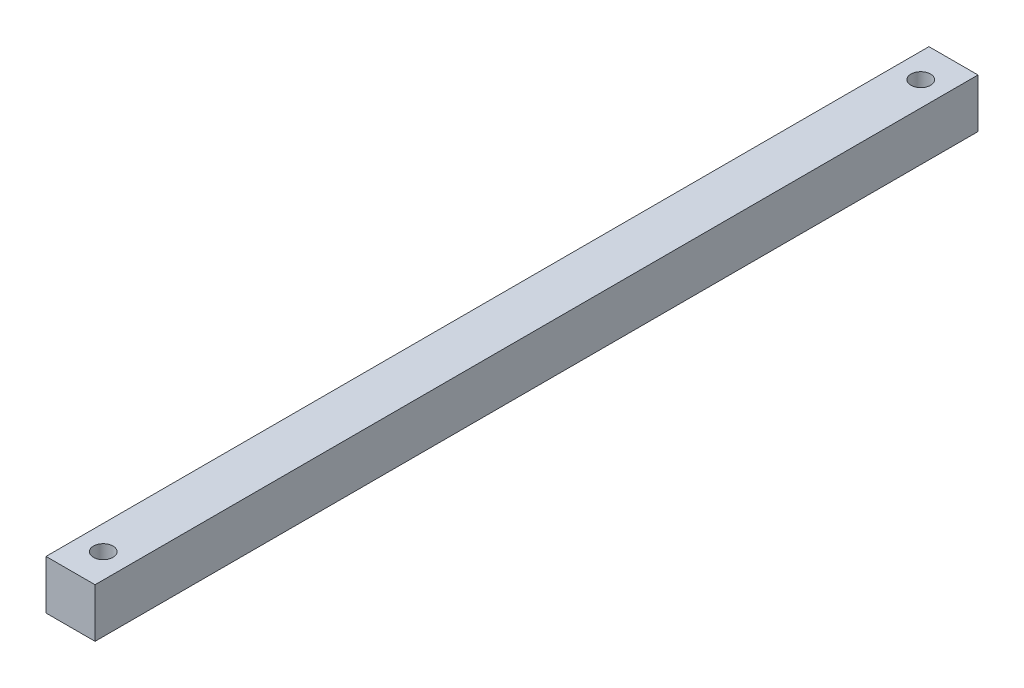
ISO-10303-21;
HEADER;
FILE_DESCRIPTION(('STEP AP214'),'2;1');
FILE_NAME('part.step','',(''),(''),'','','');
FILE_SCHEMA(('AUTOMOTIVE_DESIGN { 1 0 10303 214 1 1 1 1 }'));
ENDSEC;
DATA;
#1=APPLICATION_CONTEXT('core data for automotive mechanical design processes');
#2=APPLICATION_PROTOCOL_DEFINITION('international standard','automotive_design',2000,#1);
#3=PRODUCT_CONTEXT('',#1,'mechanical');
#4=PRODUCT('Part','Part','',(#3));
#5=PRODUCT_RELATED_PRODUCT_CATEGORY('part','',(#4));
#6=PRODUCT_DEFINITION_FORMATION('','',#4);
#7=PRODUCT_DEFINITION_CONTEXT('part definition',#1,'design');
#8=PRODUCT_DEFINITION('design','',#6,#7);
#9=PRODUCT_DEFINITION_SHAPE('','',#8);
#10=(LENGTH_UNIT() NAMED_UNIT(*) SI_UNIT(.MILLI.,.METRE.));
#11=(NAMED_UNIT(*) PLANE_ANGLE_UNIT() SI_UNIT($,.RADIAN.));
#12=(NAMED_UNIT(*) SI_UNIT($,.STERADIAN.) SOLID_ANGLE_UNIT());
#13=UNCERTAINTY_MEASURE_WITH_UNIT(LENGTH_MEASURE(1.E-05),#10,'distance_accuracy_value','');
#14=(GEOMETRIC_REPRESENTATION_CONTEXT(3) GLOBAL_UNCERTAINTY_ASSIGNED_CONTEXT((#13)) GLOBAL_UNIT_ASSIGNED_CONTEXT((#10,
#11,#12)) REPRESENTATION_CONTEXT('',''));
#15=CARTESIAN_POINT('',(0.,0.,0.));
#16=DIRECTION('',(0.,0.,1.));
#17=DIRECTION('',(1.,0.,0.));
#18=AXIS2_PLACEMENT_3D('',#15,#16,#17);
#19=CARTESIAN_POINT('',(0.,0.,270.));
#20=DIRECTION('',(1.,0.,0.));
#21=DIRECTION('',(0.,1.,0.));
#22=AXIS2_PLACEMENT_3D('',#19,#20,#21);
#23=PLANE('',#22);
#24=DIRECTION('',(0.,-1.,0.));
#25=VECTOR('',#24,1.);
#26=CARTESIAN_POINT('',(0.,0.,0.));
#27=LINE('',#26,#25);
#28=CARTESIAN_POINT('',(0.,0.,0.));
#29=VERTEX_POINT('',#28);
#30=CARTESIAN_POINT('',(0.,-15.,0.));
#31=VERTEX_POINT('',#30);
#32=EDGE_CURVE('E104',#29,#31,#27,.T.);
#33=ORIENTED_EDGE('',*,*,#32,.T.);
#34=DIRECTION('',(0.,0.,-1.));
#35=VECTOR('',#34,1.);
#36=CARTESIAN_POINT('',(0.,-15.,270.));
#37=LINE('',#36,#35);
#38=CARTESIAN_POINT('',(0.,-15.,270.));
#39=VERTEX_POINT('',#38);
#40=EDGE_CURVE('E11',#39,#31,#37,.T.);
#41=ORIENTED_EDGE('',*,*,#40,.F.);
#42=DIRECTION('',(0.,-1.,0.));
#43=VECTOR('',#42,1.);
#44=CARTESIAN_POINT('',(0.,0.,270.));
#45=LINE('',#44,#43);
#46=CARTESIAN_POINT('',(0.,0.,270.));
#47=VERTEX_POINT('',#46);
#48=EDGE_CURVE('E92',#47,#39,#45,.T.);
#49=ORIENTED_EDGE('',*,*,#48,.F.);
#50=DIRECTION('',(0.,0.,-1.));
#51=VECTOR('',#50,1.);
#52=CARTESIAN_POINT('',(0.,0.,270.));
#53=LINE('',#52,#51);
#54=EDGE_CURVE('E100',#47,#29,#53,.T.);
#55=ORIENTED_EDGE('',*,*,#54,.T.);
#56=EDGE_LOOP('',(#33,#41,#49,#55));
#57=FACE_BOUND('',#56,.T.);
#58=ADVANCED_FACE('F41',(#57),#23,.F.);
#59=CARTESIAN_POINT('',(0.,-15.,270.));
#60=DIRECTION('',(0.,1.,0.));
#61=DIRECTION('',(0.,0.,1.));
#62=AXIS2_PLACEMENT_3D('',#59,#60,#61);
#63=PLANE('',#62);
#64=CARTESIAN_POINT('',(7.5,-15.,10.));
#65=DIRECTION('',(0.,1.,0.));
#66=DIRECTION('',(0.,0.,1.));
#67=AXIS2_PLACEMENT_3D('',#64,#65,#66);
#68=CIRCLE('',#67,3.);
#69=CARTESIAN_POINT('',(7.5,-15.,13.));
#70=VERTEX_POINT('',#69);
#71=EDGE_CURVE('E107',#70,#70,#68,.T.);
#72=ORIENTED_EDGE('',*,*,#71,.T.);
#73=EDGE_LOOP('',(#72));
#74=FACE_BOUND('',#73,.T.);
#75=CARTESIAN_POINT('',(7.50000000000003,-15.,260.));
#76=DIRECTION('',(0.,1.,0.));
#77=DIRECTION('',(0.,0.,1.));
#78=AXIS2_PLACEMENT_3D('',#75,#76,#77);
#79=CIRCLE('',#78,3.);
#80=CARTESIAN_POINT('',(7.50000000000003,-15.,263.));
#81=VERTEX_POINT('',#80);
#82=EDGE_CURVE('E118',#81,#81,#79,.T.);
#83=ORIENTED_EDGE('',*,*,#82,.T.);
#84=EDGE_LOOP('',(#83));
#85=FACE_BOUND('',#84,.T.);
#86=DIRECTION('',(1.,0.,0.));
#87=VECTOR('',#86,1.);
#88=CARTESIAN_POINT('',(0.,-15.,0.));
#89=LINE('',#88,#87);
#90=CARTESIAN_POINT('',(15.,-15.,0.));
#91=VERTEX_POINT('',#90);
#92=EDGE_CURVE('E96',#31,#91,#89,.T.);
#93=ORIENTED_EDGE('',*,*,#92,.T.);
#94=DIRECTION('',(0.,0.,-1.));
#95=VECTOR('',#94,1.);
#96=CARTESIAN_POINT('',(15.,-15.,270.));
#97=LINE('',#96,#95);
#98=CARTESIAN_POINT('',(15.,-15.,270.));
#99=VERTEX_POINT('',#98);
#100=EDGE_CURVE('E49',#99,#91,#97,.T.);
#101=ORIENTED_EDGE('',*,*,#100,.F.);
#102=DIRECTION('',(1.,0.,0.));
#103=VECTOR('',#102,1.);
#104=CARTESIAN_POINT('',(0.,-15.,270.));
#105=LINE('',#104,#103);
#106=EDGE_CURVE('E87',#39,#99,#105,.T.);
#107=ORIENTED_EDGE('',*,*,#106,.F.);
#108=ORIENTED_EDGE('',*,*,#40,.T.);
#109=EDGE_LOOP('',(#93,#101,#107,#108));
#110=FACE_BOUND('',#109,.T.);
#111=ADVANCED_FACE('F95',(#74,#85,#110),#63,.F.);
#112=CARTESIAN_POINT('',(15.,0.,270.));
#113=DIRECTION('',(-1.,0.,0.));
#114=DIRECTION('',(0.,-1.,0.));
#115=AXIS2_PLACEMENT_3D('',#112,#113,#114);
#116=PLANE('',#115);
#117=DIRECTION('',(0.,1.,0.));
#118=VECTOR('',#117,1.);
#119=CARTESIAN_POINT('',(15.,0.,0.));
#120=LINE('',#119,#118);
#121=CARTESIAN_POINT('',(15.,0.,0.));
#122=VERTEX_POINT('',#121);
#123=EDGE_CURVE('E74',#91,#122,#120,.T.);
#124=ORIENTED_EDGE('',*,*,#123,.T.);
#125=DIRECTION('',(0.,0.,-1.));
#126=VECTOR('',#125,1.);
#127=CARTESIAN_POINT('',(15.,0.,270.));
#128=LINE('',#127,#126);
#129=CARTESIAN_POINT('',(15.,0.,270.));
#130=VERTEX_POINT('',#129);
#131=EDGE_CURVE('E97',#130,#122,#128,.T.);
#132=ORIENTED_EDGE('',*,*,#131,.F.);
#133=DIRECTION('',(0.,1.,0.));
#134=VECTOR('',#133,1.);
#135=CARTESIAN_POINT('',(15.,0.,270.));
#136=LINE('',#135,#134);
#137=EDGE_CURVE('E90',#99,#130,#136,.T.);
#138=ORIENTED_EDGE('',*,*,#137,.F.);
#139=ORIENTED_EDGE('',*,*,#100,.T.);
#140=EDGE_LOOP('',(#124,#132,#138,#139));
#141=FACE_BOUND('',#140,.T.);
#142=ADVANCED_FACE('F98',(#141),#116,.F.);
#143=CARTESIAN_POINT('',(0.,0.,270.));
#144=DIRECTION('',(0.,-1.,0.));
#145=DIRECTION('',(0.,0.,-1.));
#146=AXIS2_PLACEMENT_3D('',#143,#144,#145);
#147=PLANE('',#146);
#148=CARTESIAN_POINT('',(7.5,0.,10.));
#149=DIRECTION('',(0.,1.,0.));
#150=DIRECTION('',(0.,0.,1.));
#151=AXIS2_PLACEMENT_3D('',#148,#149,#150);
#152=CIRCLE('',#151,3.);
#153=CARTESIAN_POINT('',(7.5,0.,13.));
#154=VERTEX_POINT('',#153);
#155=EDGE_CURVE('E124',#154,#154,#152,.T.);
#156=ORIENTED_EDGE('',*,*,#155,.F.);
#157=EDGE_LOOP('',(#156));
#158=FACE_BOUND('',#157,.T.);
#159=CARTESIAN_POINT('',(7.50000000000003,0.,260.));
#160=DIRECTION('',(0.,1.,0.));
#161=DIRECTION('',(0.,0.,1.));
#162=AXIS2_PLACEMENT_3D('',#159,#160,#161);
#163=CIRCLE('',#162,3.);
#164=CARTESIAN_POINT('',(7.50000000000003,0.,263.));
#165=VERTEX_POINT('',#164);
#166=EDGE_CURVE('E121',#165,#165,#163,.T.);
#167=ORIENTED_EDGE('',*,*,#166,.F.);
#168=EDGE_LOOP('',(#167));
#169=FACE_BOUND('',#168,.T.);
#170=DIRECTION('',(-1.,0.,0.));
#171=VECTOR('',#170,1.);
#172=CARTESIAN_POINT('',(0.,0.,0.));
#173=LINE('',#172,#171);
#174=EDGE_CURVE('E80',#122,#29,#173,.T.);
#175=ORIENTED_EDGE('',*,*,#174,.T.);
#176=ORIENTED_EDGE('',*,*,#54,.F.);
#177=DIRECTION('',(-1.,0.,0.));
#178=VECTOR('',#177,1.);
#179=CARTESIAN_POINT('',(0.,0.,270.));
#180=LINE('',#179,#178);
#181=EDGE_CURVE('E57',#130,#47,#180,.T.);
#182=ORIENTED_EDGE('',*,*,#181,.F.);
#183=ORIENTED_EDGE('',*,*,#131,.T.);
#184=EDGE_LOOP('',(#175,#176,#182,#183));
#185=FACE_BOUND('',#184,.T.);
#186=ADVANCED_FACE('F112',(#158,#169,#185),#147,.F.);
#187=CARTESIAN_POINT('',(0.,0.,270.));
#188=DIRECTION('',(0.,0.,1.));
#189=DIRECTION('',(1.,0.,0.));
#190=AXIS2_PLACEMENT_3D('',#187,#188,#189);
#191=PLANE('',#190);
#192=ORIENTED_EDGE('',*,*,#48,.T.);
#193=ORIENTED_EDGE('',*,*,#106,.T.);
#194=ORIENTED_EDGE('',*,*,#137,.T.);
#195=ORIENTED_EDGE('',*,*,#181,.T.);
#196=EDGE_LOOP('',(#192,#193,#194,#195));
#197=FACE_BOUND('',#196,.T.);
#198=ADVANCED_FACE('F88',(#197),#191,.T.);
#199=CARTESIAN_POINT('',(0.,0.,0.));
#200=DIRECTION('',(0.,0.,1.));
#201=DIRECTION('',(1.,0.,0.));
#202=AXIS2_PLACEMENT_3D('',#199,#200,#201);
#203=PLANE('',#202);
#204=ORIENTED_EDGE('',*,*,#32,.F.);
#205=ORIENTED_EDGE('',*,*,#174,.F.);
#206=ORIENTED_EDGE('',*,*,#123,.F.);
#207=ORIENTED_EDGE('',*,*,#92,.F.);
#208=EDGE_LOOP('',(#204,#205,#206,#207));
#209=FACE_BOUND('',#208,.T.);
#210=ADVANCED_FACE('F115',(#209),#203,.F.);
#211=CARTESIAN_POINT('',(7.50000000000003,-15.,260.));
#212=DIRECTION('',(0.,1.,0.));
#213=DIRECTION('',(0.,0.,1.));
#214=AXIS2_PLACEMENT_3D('',#211,#212,#213);
#215=CYLINDRICAL_SURFACE('',#214,3.);
#216=ORIENTED_EDGE('',*,*,#82,.F.);
#217=EDGE_LOOP('',(#216));
#218=FACE_BOUND('',#217,.T.);
#219=ORIENTED_EDGE('',*,*,#166,.T.);
#220=EDGE_LOOP('',(#219));
#221=FACE_BOUND('',#220,.T.);
#222=ADVANCED_FACE('F135',(#218,#221),#215,.F.);
#223=CARTESIAN_POINT('',(7.5,-15.,10.));
#224=DIRECTION('',(0.,1.,0.));
#225=DIRECTION('',(0.,0.,1.));
#226=AXIS2_PLACEMENT_3D('',#223,#224,#225);
#227=CYLINDRICAL_SURFACE('',#226,3.);
#228=ORIENTED_EDGE('',*,*,#71,.F.);
#229=EDGE_LOOP('',(#228));
#230=FACE_BOUND('',#229,.T.);
#231=ORIENTED_EDGE('',*,*,#155,.T.);
#232=EDGE_LOOP('',(#231));
#233=FACE_BOUND('',#232,.T.);
#234=ADVANCED_FACE('F132',(#230,#233),#227,.F.);
#235=CLOSED_SHELL('',(#58,#111,#142,#186,#198,#210,#222,#234));
#236=MANIFOLD_SOLID_BREP('B2',#235);
#237=ADVANCED_BREP_SHAPE_REPRESENTATION('',(#18,#236),#14);
#238=SHAPE_DEFINITION_REPRESENTATION(#9,#237);
ENDSEC;
END-ISO-10303-21;
